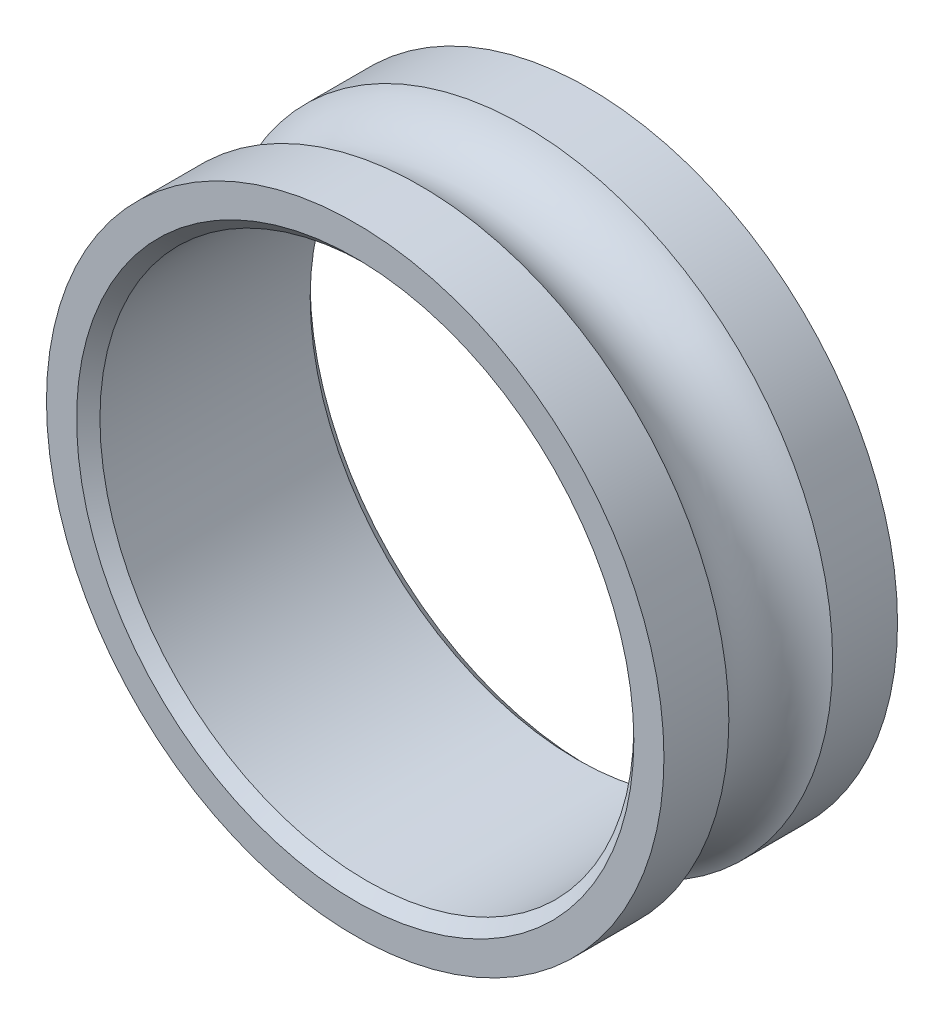
ISO-10303-21;
HEADER;
FILE_DESCRIPTION(('STEP AP214'),'2;1');
FILE_NAME('part.step','',(''),(''),'','','');
FILE_SCHEMA(('AUTOMOTIVE_DESIGN { 1 0 10303 214 1 1 1 1 }'));
ENDSEC;
DATA;
#1=APPLICATION_CONTEXT('core data for automotive mechanical design processes');
#2=APPLICATION_PROTOCOL_DEFINITION('international standard','automotive_design',2000,#1);
#3=PRODUCT_CONTEXT('',#1,'mechanical');
#4=PRODUCT('Part','Part','',(#3));
#5=PRODUCT_RELATED_PRODUCT_CATEGORY('part','',(#4));
#6=PRODUCT_DEFINITION_FORMATION('','',#4);
#7=PRODUCT_DEFINITION_CONTEXT('part definition',#1,'design');
#8=PRODUCT_DEFINITION('design','',#6,#7);
#9=PRODUCT_DEFINITION_SHAPE('','',#8);
#10=(LENGTH_UNIT() NAMED_UNIT(*) SI_UNIT(.MILLI.,.METRE.));
#11=(NAMED_UNIT(*) PLANE_ANGLE_UNIT() SI_UNIT($,.RADIAN.));
#12=(NAMED_UNIT(*) SI_UNIT($,.STERADIAN.) SOLID_ANGLE_UNIT());
#13=UNCERTAINTY_MEASURE_WITH_UNIT(LENGTH_MEASURE(1.E-05),#10,'distance_accuracy_value','');
#14=(GEOMETRIC_REPRESENTATION_CONTEXT(3) GLOBAL_UNCERTAINTY_ASSIGNED_CONTEXT((#13)) GLOBAL_UNIT_ASSIGNED_CONTEXT((#10,
#11,#12)) REPRESENTATION_CONTEXT('',''));
#15=CARTESIAN_POINT('',(0.,0.,0.));
#16=DIRECTION('',(0.,0.,1.));
#17=DIRECTION('',(1.,0.,0.));
#18=AXIS2_PLACEMENT_3D('',#15,#16,#17);
#19=CARTESIAN_POINT('',(0.,0.,0.));
#20=DIRECTION('',(0.,0.,1.));
#21=DIRECTION('',(1.,0.,0.));
#22=AXIS2_PLACEMENT_3D('',#19,#20,#21);
#23=TOROIDAL_SURFACE('',#22,4.99999999999999,0.862864380232566);
#24=CARTESIAN_POINT('',(0.,0.,0.777777777777777));
#25=DIRECTION('',(0.,0.,1.));
#26=DIRECTION('',(1.,0.,0.));
#27=AXIS2_PLACEMENT_3D('',#24,#25,#26);
#28=CIRCLE('',#27,4.62637362637363);
#29=CARTESIAN_POINT('',(4.62637362637363,0.,0.777777777777777));
#30=VERTEX_POINT('',#29);
#31=EDGE_CURVE('E32',#30,#30,#28,.T.);
#32=ORIENTED_EDGE('',*,*,#31,.F.);
#33=EDGE_LOOP('',(#32));
#34=FACE_BOUND('',#33,.T.);
#35=CARTESIAN_POINT('',(0.,0.,-0.77777777777778));
#36=DIRECTION('',(0.,0.,1.));
#37=DIRECTION('',(1.,0.,0.));
#38=AXIS2_PLACEMENT_3D('',#35,#36,#37);
#39=CIRCLE('',#38,4.62637362637363);
#40=CARTESIAN_POINT('',(4.62637362637363,0.,-0.77777777777778));
#41=VERTEX_POINT('',#40);
#42=EDGE_CURVE('E30',#41,#41,#39,.F.);
#43=ORIENTED_EDGE('',*,*,#42,.F.);
#44=EDGE_LOOP('',(#43));
#45=FACE_BOUND('',#44,.T.);
#46=ADVANCED_FACE('F14',(#34,#45),#23,.F.);
#47=CARTESIAN_POINT('',(0.,0.,1.75));
#48=DIRECTION('',(0.,0.,1.));
#49=DIRECTION('',(1.,0.,0.));
#50=AXIS2_PLACEMENT_3D('',#47,#48,#49);
#51=CYLINDRICAL_SURFACE('',#50,4.62637362637363);
#52=CARTESIAN_POINT('',(0.,0.,1.75));
#53=DIRECTION('',(0.,0.,1.));
#54=DIRECTION('',(1.,0.,0.));
#55=AXIS2_PLACEMENT_3D('',#52,#53,#54);
#56=CIRCLE('',#55,4.62637362637363);
#57=CARTESIAN_POINT('',(4.62637362637363,0.,1.75));
#58=VERTEX_POINT('',#57);
#59=EDGE_CURVE('E18',#58,#58,#56,.F.);
#60=ORIENTED_EDGE('',*,*,#59,.T.);
#61=EDGE_LOOP('',(#60));
#62=FACE_BOUND('',#61,.T.);
#63=ORIENTED_EDGE('',*,*,#31,.T.);
#64=EDGE_LOOP('',(#63));
#65=FACE_BOUND('',#64,.T.);
#66=ADVANCED_FACE('F48',(#62,#65),#51,.T.);
#67=CARTESIAN_POINT('',(0.,0.,1.75));
#68=DIRECTION('',(0.,0.,1.));
#69=DIRECTION('',(1.,0.,0.));
#70=AXIS2_PLACEMENT_3D('',#67,#68,#69);
#71=CYLINDRICAL_SURFACE('',#70,4.62637362637363);
#72=ORIENTED_EDGE('',*,*,#42,.T.);
#73=EDGE_LOOP('',(#72));
#74=FACE_BOUND('',#73,.T.);
#75=CARTESIAN_POINT('',(0.,0.,-1.75));
#76=DIRECTION('',(0.,0.,1.));
#77=DIRECTION('',(1.,0.,0.));
#78=AXIS2_PLACEMENT_3D('',#75,#76,#77);
#79=CIRCLE('',#78,4.62637362637363);
#80=CARTESIAN_POINT('',(4.62637362637363,0.,-1.75));
#81=VERTEX_POINT('',#80);
#82=EDGE_CURVE('E41',#81,#81,#79,.T.);
#83=ORIENTED_EDGE('',*,*,#82,.T.);
#84=EDGE_LOOP('',(#83));
#85=FACE_BOUND('',#84,.T.);
#86=ADVANCED_FACE('F55',(#74,#85),#71,.T.);
#87=CARTESIAN_POINT('',(0.,4.62637362637363,1.75));
#88=DIRECTION('',(0.,0.,-1.));
#89=DIRECTION('',(-1.,0.,0.));
#90=AXIS2_PLACEMENT_3D('',#87,#88,#89);
#91=PLANE('',#90);
#92=ORIENTED_EDGE('',*,*,#59,.F.);
#93=EDGE_LOOP('',(#92));
#94=FACE_BOUND('',#93,.T.);
#95=CARTESIAN_POINT('',(0.,0.,1.74999999995862));
#96=DIRECTION('',(0.,0.,1.));
#97=DIRECTION('',(1.,0.,0.));
#98=AXIS2_PLACEMENT_3D('',#95,#96,#97);
#99=CIRCLE('',#98,4.17499999997517);
#100=CARTESIAN_POINT('',(4.17499999997517,0.,1.74999999995862));
#101=VERTEX_POINT('',#100);
#102=EDGE_CURVE('E39',#101,#101,#99,.F.);
#103=ORIENTED_EDGE('',*,*,#102,.T.);
#104=EDGE_LOOP('',(#103));
#105=FACE_BOUND('',#104,.T.);
#106=ADVANCED_FACE('F51',(#94,#105),#91,.F.);
#107=CARTESIAN_POINT('',(0.,4.175,-1.75));
#108=DIRECTION('',(0.,0.,1.));
#109=DIRECTION('',(1.,0.,0.));
#110=AXIS2_PLACEMENT_3D('',#107,#108,#109);
#111=PLANE('',#110);
#112=CARTESIAN_POINT('',(0.,0.,-1.75000000001546));
#113=DIRECTION('',(0.,0.,-1.));
#114=DIRECTION('',(-1.,0.,0.));
#115=AXIS2_PLACEMENT_3D('',#112,#113,#114);
#116=CIRCLE('',#115,4.17500000003201);
#117=CARTESIAN_POINT('',(-4.17500000003201,0.,-1.75000000001546));
#118=VERTEX_POINT('',#117);
#119=EDGE_CURVE('E27',#118,#118,#116,.F.);
#120=ORIENTED_EDGE('',*,*,#119,.T.);
#121=EDGE_LOOP('',(#120));
#122=FACE_BOUND('',#121,.T.);
#123=ORIENTED_EDGE('',*,*,#82,.F.);
#124=EDGE_LOOP('',(#123));
#125=FACE_BOUND('',#124,.T.);
#126=ADVANCED_FACE('F54',(#122,#125),#111,.F.);
#127=CARTESIAN_POINT('',(0.,0.,1.74999999995862));
#128=DIRECTION('',(0.,0.,1.));
#129=DIRECTION('',(1.,0.,0.));
#130=AXIS2_PLACEMENT_3D('',#127,#128,#129);
#131=CONICAL_SURFACE('',#130,4.17499999997517,0.785398163397448);
#132=ORIENTED_EDGE('',*,*,#102,.F.);
#133=EDGE_LOOP('',(#132));
#134=FACE_BOUND('',#133,.T.);
#135=CARTESIAN_POINT('',(0.,0.,1.575));
#136=DIRECTION('',(0.,0.,1.));
#137=DIRECTION('',(1.,0.,0.));
#138=AXIS2_PLACEMENT_3D('',#135,#136,#137);
#139=CIRCLE('',#138,4.);
#140=CARTESIAN_POINT('',(4.,0.,1.575));
#141=VERTEX_POINT('',#140);
#142=EDGE_CURVE('E22',#141,#141,#139,.F.);
#143=ORIENTED_EDGE('',*,*,#142,.T.);
#144=EDGE_LOOP('',(#143));
#145=FACE_BOUND('',#144,.T.);
#146=ADVANCED_FACE('F59',(#134,#145),#131,.F.);
#147=CARTESIAN_POINT('',(0.,0.,-1.74999999995862));
#148=DIRECTION('',(0.,0.,-1.));
#149=DIRECTION('',(-1.,0.,0.));
#150=AXIS2_PLACEMENT_3D('',#147,#148,#149);
#151=CONICAL_SURFACE('',#150,4.17499999997517,0.785398163397448);
#152=CARTESIAN_POINT('',(0.,0.,-1.575));
#153=DIRECTION('',(0.,0.,1.));
#154=DIRECTION('',(1.,0.,0.));
#155=AXIS2_PLACEMENT_3D('',#152,#153,#154);
#156=CIRCLE('',#155,4.);
#157=CARTESIAN_POINT('',(4.,0.,-1.575));
#158=VERTEX_POINT('',#157);
#159=EDGE_CURVE('E10',#158,#158,#156,.T.);
#160=ORIENTED_EDGE('',*,*,#159,.T.);
#161=EDGE_LOOP('',(#160));
#162=FACE_BOUND('',#161,.T.);
#163=ORIENTED_EDGE('',*,*,#119,.F.);
#164=EDGE_LOOP('',(#163));
#165=FACE_BOUND('',#164,.T.);
#166=ADVANCED_FACE('F62',(#162,#165),#151,.F.);
#167=CARTESIAN_POINT('',(0.,0.,1.75));
#168=DIRECTION('',(0.,0.,1.));
#169=DIRECTION('',(1.,0.,0.));
#170=AXIS2_PLACEMENT_3D('',#167,#168,#169);
#171=CYLINDRICAL_SURFACE('',#170,4.);
#172=ORIENTED_EDGE('',*,*,#142,.F.);
#173=EDGE_LOOP('',(#172));
#174=FACE_BOUND('',#173,.T.);
#175=ORIENTED_EDGE('',*,*,#159,.F.);
#176=EDGE_LOOP('',(#175));
#177=FACE_BOUND('',#176,.T.);
#178=ADVANCED_FACE('F66',(#174,#177),#171,.F.);
#179=CLOSED_SHELL('',(#46,#66,#86,#106,#126,#146,#166,#178));
#180=MANIFOLD_SOLID_BREP('B1',#179);
#181=ADVANCED_BREP_SHAPE_REPRESENTATION('',(#18,#180),#14);
#182=SHAPE_DEFINITION_REPRESENTATION(#9,#181);
ENDSEC;
END-ISO-10303-21;
